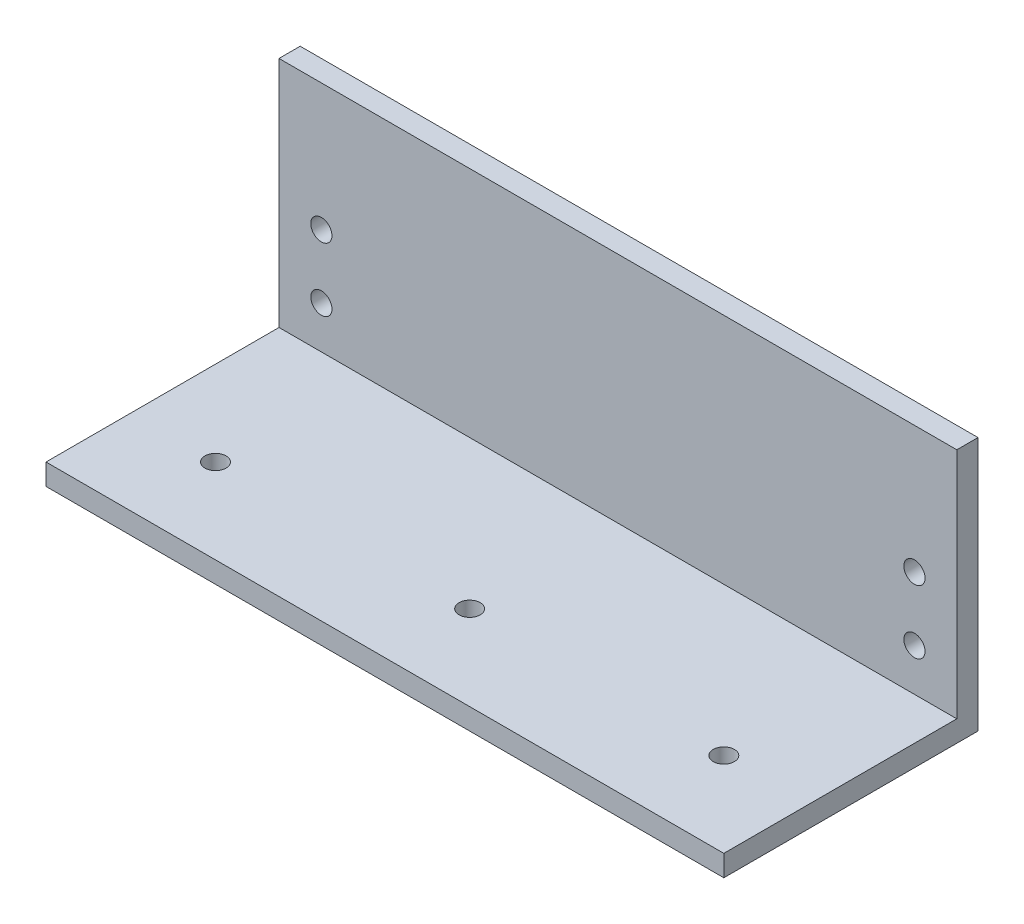
ISO-10303-21;
HEADER;
FILE_DESCRIPTION(('STEP AP214'),'2;1');
FILE_NAME('part.step','',(''),(''),'','','');
FILE_SCHEMA(('AUTOMOTIVE_DESIGN { 1 0 10303 214 1 1 1 1 }'));
ENDSEC;
DATA;
#1=APPLICATION_CONTEXT('core data for automotive mechanical design processes');
#2=APPLICATION_PROTOCOL_DEFINITION('international standard','automotive_design',2000,#1);
#3=PRODUCT_CONTEXT('',#1,'mechanical');
#4=PRODUCT('Part','Part','',(#3));
#5=PRODUCT_RELATED_PRODUCT_CATEGORY('part','',(#4));
#6=PRODUCT_DEFINITION_FORMATION('','',#4);
#7=PRODUCT_DEFINITION_CONTEXT('part definition',#1,'design');
#8=PRODUCT_DEFINITION('design','',#6,#7);
#9=PRODUCT_DEFINITION_SHAPE('','',#8);
#10=(LENGTH_UNIT() NAMED_UNIT(*) SI_UNIT(.MILLI.,.METRE.));
#11=(NAMED_UNIT(*) PLANE_ANGLE_UNIT() SI_UNIT($,.RADIAN.));
#12=(NAMED_UNIT(*) SI_UNIT($,.STERADIAN.) SOLID_ANGLE_UNIT());
#13=UNCERTAINTY_MEASURE_WITH_UNIT(LENGTH_MEASURE(1.E-05),#10,'distance_accuracy_value','');
#14=(GEOMETRIC_REPRESENTATION_CONTEXT(3) GLOBAL_UNCERTAINTY_ASSIGNED_CONTEXT((#13)) GLOBAL_UNIT_ASSIGNED_CONTEXT((#10,
#11,#12)) REPRESENTATION_CONTEXT('',''));
#15=CARTESIAN_POINT('',(0.,0.,0.));
#16=DIRECTION('',(0.,0.,1.));
#17=DIRECTION('',(1.,0.,0.));
#18=AXIS2_PLACEMENT_3D('',#15,#16,#17);
#19=CARTESIAN_POINT('',(203.2,76.2,0.));
#20=DIRECTION('',(0.,1.,0.));
#21=DIRECTION('',(0.,0.,1.));
#22=AXIS2_PLACEMENT_3D('',#19,#20,#21);
#23=PLANE('',#22);
#24=DIRECTION('',(0.,0.,-1.));
#25=VECTOR('',#24,1.);
#26=CARTESIAN_POINT('',(0.,76.2,0.));
#27=LINE('',#26,#25);
#28=CARTESIAN_POINT('',(0.,76.2,-69.85));
#29=VERTEX_POINT('',#28);
#30=CARTESIAN_POINT('',(0.,76.2,-76.2));
#31=VERTEX_POINT('',#30);
#32=EDGE_CURVE('E118',#29,#31,#27,.T.);
#33=ORIENTED_EDGE('',*,*,#32,.F.);
#34=DIRECTION('',(-1.,0.,0.));
#35=VECTOR('',#34,1.);
#36=CARTESIAN_POINT('',(203.2,76.2,-69.85));
#37=LINE('',#36,#35);
#38=CARTESIAN_POINT('',(203.2,76.2,-69.85));
#39=VERTEX_POINT('',#38);
#40=EDGE_CURVE('E11',#39,#29,#37,.T.);
#41=ORIENTED_EDGE('',*,*,#40,.F.);
#42=DIRECTION('',(0.,0.,-1.));
#43=VECTOR('',#42,1.);
#44=CARTESIAN_POINT('',(203.2,76.2,0.));
#45=LINE('',#44,#43);
#46=CARTESIAN_POINT('',(203.2,76.2,-76.2));
#47=VERTEX_POINT('',#46);
#48=EDGE_CURVE('E132',#39,#47,#45,.T.);
#49=ORIENTED_EDGE('',*,*,#48,.T.);
#50=DIRECTION('',(-1.,0.,0.));
#51=VECTOR('',#50,1.);
#52=CARTESIAN_POINT('',(203.2,76.2,-76.2));
#53=LINE('',#52,#51);
#54=EDGE_CURVE('E80',#47,#31,#53,.T.);
#55=ORIENTED_EDGE('',*,*,#54,.T.);
#56=EDGE_LOOP('',(#33,#41,#49,#55));
#57=FACE_BOUND('',#56,.T.);
#58=ADVANCED_FACE('F34',(#57),#23,.T.);
#59=CARTESIAN_POINT('',(203.2,0.,-69.85));
#60=DIRECTION('',(0.,0.,-1.));
#61=DIRECTION('',(0.,1.,0.));
#62=AXIS2_PLACEMENT_3D('',#59,#60,#61);
#63=PLANE('',#62);
#64=CARTESIAN_POINT('',(12.7,38.1,-69.85));
#65=DIRECTION('',(0.,0.,-1.));
#66=DIRECTION('',(0.,1.,0.));
#67=AXIS2_PLACEMENT_3D('',#64,#65,#66);
#68=CIRCLE('',#67,3.175);
#69=CARTESIAN_POINT('',(12.7,41.275,-69.85));
#70=VERTEX_POINT('',#69);
#71=EDGE_CURVE('E158',#70,#70,#68,.T.);
#72=ORIENTED_EDGE('',*,*,#71,.T.);
#73=EDGE_LOOP('',(#72));
#74=FACE_BOUND('',#73,.T.);
#75=CARTESIAN_POINT('',(12.7,19.05,-69.85));
#76=DIRECTION('',(0.,0.,-1.));
#77=DIRECTION('',(0.,1.,0.));
#78=AXIS2_PLACEMENT_3D('',#75,#76,#77);
#79=CIRCLE('',#78,3.175);
#80=CARTESIAN_POINT('',(12.7,22.225,-69.85));
#81=VERTEX_POINT('',#80);
#82=EDGE_CURVE('E164',#81,#81,#79,.T.);
#83=ORIENTED_EDGE('',*,*,#82,.T.);
#84=EDGE_LOOP('',(#83));
#85=FACE_BOUND('',#84,.T.);
#86=CARTESIAN_POINT('',(190.5,38.1,-69.85));
#87=DIRECTION('',(0.,0.,-1.));
#88=DIRECTION('',(0.,1.,0.));
#89=AXIS2_PLACEMENT_3D('',#86,#87,#88);
#90=CIRCLE('',#89,3.175);
#91=CARTESIAN_POINT('',(190.5,41.275,-69.85));
#92=VERTEX_POINT('',#91);
#93=EDGE_CURVE('E170',#92,#92,#90,.T.);
#94=ORIENTED_EDGE('',*,*,#93,.T.);
#95=EDGE_LOOP('',(#94));
#96=FACE_BOUND('',#95,.T.);
#97=CARTESIAN_POINT('',(190.5,19.05,-69.85));
#98=DIRECTION('',(0.,0.,-1.));
#99=DIRECTION('',(0.,1.,0.));
#100=AXIS2_PLACEMENT_3D('',#97,#98,#99);
#101=CIRCLE('',#100,3.175);
#102=CARTESIAN_POINT('',(190.5,22.225,-69.85));
#103=VERTEX_POINT('',#102);
#104=EDGE_CURVE('E122',#103,#103,#101,.T.);
#105=ORIENTED_EDGE('',*,*,#104,.T.);
#106=EDGE_LOOP('',(#105));
#107=FACE_BOUND('',#106,.T.);
#108=DIRECTION('',(0.,-1.,0.));
#109=VECTOR('',#108,1.);
#110=CARTESIAN_POINT('',(0.,0.,-69.85));
#111=LINE('',#110,#109);
#112=CARTESIAN_POINT('',(0.,6.35,-69.85));
#113=VERTEX_POINT('',#112);
#114=EDGE_CURVE('E121',#29,#113,#111,.T.);
#115=ORIENTED_EDGE('',*,*,#114,.T.);
#116=DIRECTION('',(-1.,0.,0.));
#117=VECTOR('',#116,1.);
#118=CARTESIAN_POINT('',(203.2,6.35,-69.85));
#119=LINE('',#118,#117);
#120=CARTESIAN_POINT('',(203.2,6.35,-69.85));
#121=VERTEX_POINT('',#120);
#122=EDGE_CURVE('E43',#121,#113,#119,.T.);
#123=ORIENTED_EDGE('',*,*,#122,.F.);
#124=DIRECTION('',(0.,-1.,0.));
#125=VECTOR('',#124,1.);
#126=CARTESIAN_POINT('',(203.2,0.,-69.85));
#127=LINE('',#126,#125);
#128=EDGE_CURVE('E113',#39,#121,#127,.T.);
#129=ORIENTED_EDGE('',*,*,#128,.F.);
#130=ORIENTED_EDGE('',*,*,#40,.T.);
#131=EDGE_LOOP('',(#115,#123,#129,#130));
#132=FACE_BOUND('',#131,.T.);
#133=ADVANCED_FACE('F180',(#74,#85,#96,#107,#132),#63,.F.);
#134=CARTESIAN_POINT('',(203.2,6.35,0.));
#135=DIRECTION('',(0.,1.,0.));
#136=DIRECTION('',(0.,0.,1.));
#137=AXIS2_PLACEMENT_3D('',#134,#135,#136);
#138=PLANE('',#137);
#139=CARTESIAN_POINT('',(101.6,6.35,-25.4));
#140=DIRECTION('',(0.,1.,0.));
#141=DIRECTION('',(0.,0.,1.));
#142=AXIS2_PLACEMENT_3D('',#139,#140,#141);
#143=CIRCLE('',#142,3.175);
#144=CARTESIAN_POINT('',(101.6,6.35,-22.225));
#145=VERTEX_POINT('',#144);
#146=EDGE_CURVE('E153',#145,#145,#143,.T.);
#147=ORIENTED_EDGE('',*,*,#146,.F.);
#148=EDGE_LOOP('',(#147));
#149=FACE_BOUND('',#148,.T.);
#150=CARTESIAN_POINT('',(177.8,6.35,-25.4));
#151=DIRECTION('',(0.,1.,0.));
#152=DIRECTION('',(0.,0.,1.));
#153=AXIS2_PLACEMENT_3D('',#150,#151,#152);
#154=CIRCLE('',#153,3.175);
#155=CARTESIAN_POINT('',(177.8,6.35,-22.225));
#156=VERTEX_POINT('',#155);
#157=EDGE_CURVE('E143',#156,#156,#154,.T.);
#158=ORIENTED_EDGE('',*,*,#157,.F.);
#159=EDGE_LOOP('',(#158));
#160=FACE_BOUND('',#159,.T.);
#161=CARTESIAN_POINT('',(25.4,6.35,-25.4));
#162=DIRECTION('',(0.,1.,0.));
#163=DIRECTION('',(0.,0.,1.));
#164=AXIS2_PLACEMENT_3D('',#161,#162,#163);
#165=CIRCLE('',#164,3.175);
#166=CARTESIAN_POINT('',(25.4,6.35,-22.225));
#167=VERTEX_POINT('',#166);
#168=EDGE_CURVE('E140',#167,#167,#165,.T.);
#169=ORIENTED_EDGE('',*,*,#168,.F.);
#170=EDGE_LOOP('',(#169));
#171=FACE_BOUND('',#170,.T.);
#172=DIRECTION('',(0.,0.,-1.));
#173=VECTOR('',#172,1.);
#174=CARTESIAN_POINT('',(0.,6.35,0.));
#175=LINE('',#174,#173);
#176=CARTESIAN_POINT('',(0.,6.35,0.));
#177=VERTEX_POINT('',#176);
#178=EDGE_CURVE('E125',#177,#113,#175,.T.);
#179=ORIENTED_EDGE('',*,*,#178,.F.);
#180=DIRECTION('',(-1.,0.,0.));
#181=VECTOR('',#180,1.);
#182=CARTESIAN_POINT('',(203.2,6.35,0.));
#183=LINE('',#182,#181);
#184=CARTESIAN_POINT('',(203.2,6.35,0.));
#185=VERTEX_POINT('',#184);
#186=EDGE_CURVE('E102',#185,#177,#183,.T.);
#187=ORIENTED_EDGE('',*,*,#186,.F.);
#188=DIRECTION('',(0.,0.,-1.));
#189=VECTOR('',#188,1.);
#190=CARTESIAN_POINT('',(203.2,6.35,0.));
#191=LINE('',#190,#189);
#192=EDGE_CURVE('E111',#185,#121,#191,.T.);
#193=ORIENTED_EDGE('',*,*,#192,.T.);
#194=ORIENTED_EDGE('',*,*,#122,.T.);
#195=EDGE_LOOP('',(#179,#187,#193,#194));
#196=FACE_BOUND('',#195,.T.);
#197=ADVANCED_FACE('F184',(#149,#160,#171,#196),#138,.T.);
#198=CARTESIAN_POINT('',(203.2,0.,0.));
#199=DIRECTION('',(0.,0.,1.));
#200=DIRECTION('',(1.,0.,0.));
#201=AXIS2_PLACEMENT_3D('',#198,#199,#200);
#202=PLANE('',#201);
#203=DIRECTION('',(0.,1.,0.));
#204=VECTOR('',#203,1.);
#205=CARTESIAN_POINT('',(0.,0.,0.));
#206=LINE('',#205,#204);
#207=CARTESIAN_POINT('',(0.,0.,0.));
#208=VERTEX_POINT('',#207);
#209=EDGE_CURVE('E101',#208,#177,#206,.T.);
#210=ORIENTED_EDGE('',*,*,#209,.F.);
#211=DIRECTION('',(-1.,0.,0.));
#212=VECTOR('',#211,1.);
#213=CARTESIAN_POINT('',(203.2,0.,0.));
#214=LINE('',#213,#212);
#215=CARTESIAN_POINT('',(203.2,0.,0.));
#216=VERTEX_POINT('',#215);
#217=EDGE_CURVE('E95',#216,#208,#214,.T.);
#218=ORIENTED_EDGE('',*,*,#217,.F.);
#219=DIRECTION('',(0.,1.,0.));
#220=VECTOR('',#219,1.);
#221=CARTESIAN_POINT('',(203.2,0.,0.));
#222=LINE('',#221,#220);
#223=EDGE_CURVE('E99',#216,#185,#222,.T.);
#224=ORIENTED_EDGE('',*,*,#223,.T.);
#225=ORIENTED_EDGE('',*,*,#186,.T.);
#226=EDGE_LOOP('',(#210,#218,#224,#225));
#227=FACE_BOUND('',#226,.T.);
#228=ADVANCED_FACE('F97',(#227),#202,.T.);
#229=CARTESIAN_POINT('',(203.2,0.,0.));
#230=DIRECTION('',(0.,1.,0.));
#231=DIRECTION('',(0.,0.,1.));
#232=AXIS2_PLACEMENT_3D('',#229,#230,#231);
#233=PLANE('',#232);
#234=CARTESIAN_POINT('',(101.6,0.,-25.4));
#235=DIRECTION('',(0.,1.,0.));
#236=DIRECTION('',(0.,0.,1.));
#237=AXIS2_PLACEMENT_3D('',#234,#235,#236);
#238=CIRCLE('',#237,3.175);
#239=CARTESIAN_POINT('',(101.6,0.,-22.225));
#240=VERTEX_POINT('',#239);
#241=EDGE_CURVE('E37',#240,#240,#238,.T.);
#242=ORIENTED_EDGE('',*,*,#241,.T.);
#243=EDGE_LOOP('',(#242));
#244=FACE_BOUND('',#243,.T.);
#245=CARTESIAN_POINT('',(177.8,0.,-25.4));
#246=DIRECTION('',(0.,1.,0.));
#247=DIRECTION('',(0.,0.,1.));
#248=AXIS2_PLACEMENT_3D('',#245,#246,#247);
#249=CIRCLE('',#248,3.175);
#250=CARTESIAN_POINT('',(177.8,0.,-22.225));
#251=VERTEX_POINT('',#250);
#252=EDGE_CURVE('E141',#251,#251,#249,.T.);
#253=ORIENTED_EDGE('',*,*,#252,.T.);
#254=EDGE_LOOP('',(#253));
#255=FACE_BOUND('',#254,.T.);
#256=CARTESIAN_POINT('',(25.4,0.,-25.4));
#257=DIRECTION('',(0.,1.,0.));
#258=DIRECTION('',(0.,0.,1.));
#259=AXIS2_PLACEMENT_3D('',#256,#257,#258);
#260=CIRCLE('',#259,3.175);
#261=CARTESIAN_POINT('',(25.4,0.,-22.225));
#262=VERTEX_POINT('',#261);
#263=EDGE_CURVE('E137',#262,#262,#260,.T.);
#264=ORIENTED_EDGE('',*,*,#263,.T.);
#265=EDGE_LOOP('',(#264));
#266=FACE_BOUND('',#265,.T.);
#267=DIRECTION('',(0.,0.,-1.));
#268=VECTOR('',#267,1.);
#269=CARTESIAN_POINT('',(0.,0.,0.));
#270=LINE('',#269,#268);
#271=CARTESIAN_POINT('',(0.,0.,-76.2));
#272=VERTEX_POINT('',#271);
#273=EDGE_CURVE('E73',#208,#272,#270,.T.);
#274=ORIENTED_EDGE('',*,*,#273,.T.);
#275=DIRECTION('',(-1.,0.,0.));
#276=VECTOR('',#275,1.);
#277=CARTESIAN_POINT('',(203.2,0.,-76.2));
#278=LINE('',#277,#276);
#279=CARTESIAN_POINT('',(203.2,0.,-76.2));
#280=VERTEX_POINT('',#279);
#281=EDGE_CURVE('E103',#280,#272,#278,.T.);
#282=ORIENTED_EDGE('',*,*,#281,.F.);
#283=DIRECTION('',(0.,0.,-1.));
#284=VECTOR('',#283,1.);
#285=CARTESIAN_POINT('',(203.2,0.,0.));
#286=LINE('',#285,#284);
#287=EDGE_CURVE('E105',#216,#280,#286,.T.);
#288=ORIENTED_EDGE('',*,*,#287,.F.);
#289=ORIENTED_EDGE('',*,*,#217,.T.);
#290=EDGE_LOOP('',(#274,#282,#288,#289));
#291=FACE_BOUND('',#290,.T.);
#292=ADVANCED_FACE('F106',(#244,#255,#266,#291),#233,.F.);
#293=CARTESIAN_POINT('',(203.2,0.,-76.2));
#294=DIRECTION('',(0.,0.,1.));
#295=DIRECTION('',(1.,0.,0.));
#296=AXIS2_PLACEMENT_3D('',#293,#294,#295);
#297=PLANE('',#296);
#298=CARTESIAN_POINT('',(12.7,38.1,-76.2));
#299=DIRECTION('',(0.,0.,-1.));
#300=DIRECTION('',(-1.,0.,0.));
#301=AXIS2_PLACEMENT_3D('',#298,#299,#300);
#302=CIRCLE('',#301,3.175);
#303=CARTESIAN_POINT('',(9.52499999999999,38.1,-76.2));
#304=VERTEX_POINT('',#303);
#305=EDGE_CURVE('E139',#304,#304,#302,.T.);
#306=ORIENTED_EDGE('',*,*,#305,.F.);
#307=EDGE_LOOP('',(#306));
#308=FACE_BOUND('',#307,.T.);
#309=CARTESIAN_POINT('',(12.7,19.05,-76.2));
#310=DIRECTION('',(0.,0.,-1.));
#311=DIRECTION('',(-1.,0.,0.));
#312=AXIS2_PLACEMENT_3D('',#309,#310,#311);
#313=CIRCLE('',#312,3.175);
#314=CARTESIAN_POINT('',(9.52499999999999,19.05,-76.2));
#315=VERTEX_POINT('',#314);
#316=EDGE_CURVE('E161',#315,#315,#313,.T.);
#317=ORIENTED_EDGE('',*,*,#316,.F.);
#318=EDGE_LOOP('',(#317));
#319=FACE_BOUND('',#318,.T.);
#320=CARTESIAN_POINT('',(190.5,38.1,-76.2));
#321=DIRECTION('',(0.,0.,-1.));
#322=DIRECTION('',(-1.,0.,0.));
#323=AXIS2_PLACEMENT_3D('',#320,#321,#322);
#324=CIRCLE('',#323,3.175);
#325=CARTESIAN_POINT('',(187.325,38.1,-76.2));
#326=VERTEX_POINT('',#325);
#327=EDGE_CURVE('E167',#326,#326,#324,.T.);
#328=ORIENTED_EDGE('',*,*,#327,.F.);
#329=EDGE_LOOP('',(#328));
#330=FACE_BOUND('',#329,.T.);
#331=CARTESIAN_POINT('',(190.5,19.05,-76.2));
#332=DIRECTION('',(0.,0.,-1.));
#333=DIRECTION('',(-1.,0.,0.));
#334=AXIS2_PLACEMENT_3D('',#331,#332,#333);
#335=CIRCLE('',#334,3.175);
#336=CARTESIAN_POINT('',(187.325,19.05,-76.2));
#337=VERTEX_POINT('',#336);
#338=EDGE_CURVE('E173',#337,#337,#335,.T.);
#339=ORIENTED_EDGE('',*,*,#338,.F.);
#340=EDGE_LOOP('',(#339));
#341=FACE_BOUND('',#340,.T.);
#342=DIRECTION('',(0.,1.,0.));
#343=VECTOR('',#342,1.);
#344=CARTESIAN_POINT('',(0.,0.,-76.2));
#345=LINE('',#344,#343);
#346=EDGE_CURVE('E130',#272,#31,#345,.T.);
#347=ORIENTED_EDGE('',*,*,#346,.T.);
#348=ORIENTED_EDGE('',*,*,#54,.F.);
#349=DIRECTION('',(0.,1.,0.));
#350=VECTOR('',#349,1.);
#351=CARTESIAN_POINT('',(203.2,0.,-76.2));
#352=LINE('',#351,#350);
#353=EDGE_CURVE('E52',#280,#47,#352,.T.);
#354=ORIENTED_EDGE('',*,*,#353,.F.);
#355=ORIENTED_EDGE('',*,*,#281,.T.);
#356=EDGE_LOOP('',(#347,#348,#354,#355));
#357=FACE_BOUND('',#356,.T.);
#358=ADVANCED_FACE('F189',(#308,#319,#330,#341,#357),#297,.F.);
#359=CARTESIAN_POINT('',(203.2,0.,0.));
#360=DIRECTION('',(1.,0.,0.));
#361=DIRECTION('',(0.,0.,-1.));
#362=AXIS2_PLACEMENT_3D('',#359,#360,#361);
#363=PLANE('',#362);
#364=ORIENTED_EDGE('',*,*,#48,.F.);
#365=ORIENTED_EDGE('',*,*,#128,.T.);
#366=ORIENTED_EDGE('',*,*,#192,.F.);
#367=ORIENTED_EDGE('',*,*,#223,.F.);
#368=ORIENTED_EDGE('',*,*,#287,.T.);
#369=ORIENTED_EDGE('',*,*,#353,.T.);
#370=EDGE_LOOP('',(#364,#365,#366,#367,#368,#369));
#371=FACE_BOUND('',#370,.T.);
#372=ADVANCED_FACE('F109',(#371),#363,.T.);
#373=CARTESIAN_POINT('',(0.,0.,0.));
#374=DIRECTION('',(1.,0.,0.));
#375=DIRECTION('',(0.,0.,-1.));
#376=AXIS2_PLACEMENT_3D('',#373,#374,#375);
#377=PLANE('',#376);
#378=ORIENTED_EDGE('',*,*,#32,.T.);
#379=ORIENTED_EDGE('',*,*,#346,.F.);
#380=ORIENTED_EDGE('',*,*,#273,.F.);
#381=ORIENTED_EDGE('',*,*,#209,.T.);
#382=ORIENTED_EDGE('',*,*,#178,.T.);
#383=ORIENTED_EDGE('',*,*,#114,.F.);
#384=EDGE_LOOP('',(#378,#379,#380,#381,#382,#383));
#385=FACE_BOUND('',#384,.T.);
#386=ADVANCED_FACE('F186',(#385),#377,.F.);
#387=CARTESIAN_POINT('',(190.5,19.05,-4.57200000000001));
#388=DIRECTION('',(0.,0.,-1.));
#389=DIRECTION('',(-1.,0.,0.));
#390=AXIS2_PLACEMENT_3D('',#387,#388,#389);
#391=CYLINDRICAL_SURFACE('',#390,3.175);
#392=ORIENTED_EDGE('',*,*,#338,.T.);
#393=EDGE_LOOP('',(#392));
#394=FACE_BOUND('',#393,.T.);
#395=ORIENTED_EDGE('',*,*,#104,.F.);
#396=EDGE_LOOP('',(#395));
#397=FACE_BOUND('',#396,.T.);
#398=ADVANCED_FACE('F212',(#394,#397),#391,.F.);
#399=CARTESIAN_POINT('',(190.5,38.1,-4.57200000000001));
#400=DIRECTION('',(0.,0.,-1.));
#401=DIRECTION('',(-1.,0.,0.));
#402=AXIS2_PLACEMENT_3D('',#399,#400,#401);
#403=CYLINDRICAL_SURFACE('',#402,3.175);
#404=ORIENTED_EDGE('',*,*,#327,.T.);
#405=EDGE_LOOP('',(#404));
#406=FACE_BOUND('',#405,.T.);
#407=ORIENTED_EDGE('',*,*,#93,.F.);
#408=EDGE_LOOP('',(#407));
#409=FACE_BOUND('',#408,.T.);
#410=ADVANCED_FACE('F217',(#406,#409),#403,.F.);
#411=CARTESIAN_POINT('',(12.7,19.05,-4.57200000000001));
#412=DIRECTION('',(0.,0.,-1.));
#413=DIRECTION('',(-1.,0.,0.));
#414=AXIS2_PLACEMENT_3D('',#411,#412,#413);
#415=CYLINDRICAL_SURFACE('',#414,3.175);
#416=ORIENTED_EDGE('',*,*,#316,.T.);
#417=EDGE_LOOP('',(#416));
#418=FACE_BOUND('',#417,.T.);
#419=ORIENTED_EDGE('',*,*,#82,.F.);
#420=EDGE_LOOP('',(#419));
#421=FACE_BOUND('',#420,.T.);
#422=ADVANCED_FACE('F221',(#418,#421),#415,.F.);
#423=CARTESIAN_POINT('',(12.7,38.1,-4.57200000000001));
#424=DIRECTION('',(0.,0.,-1.));
#425=DIRECTION('',(-1.,0.,0.));
#426=AXIS2_PLACEMENT_3D('',#423,#424,#425);
#427=CYLINDRICAL_SURFACE('',#426,3.175);
#428=ORIENTED_EDGE('',*,*,#305,.T.);
#429=EDGE_LOOP('',(#428));
#430=FACE_BOUND('',#429,.T.);
#431=ORIENTED_EDGE('',*,*,#71,.F.);
#432=EDGE_LOOP('',(#431));
#433=FACE_BOUND('',#432,.T.);
#434=ADVANCED_FACE('F225',(#430,#433),#427,.F.);
#435=CARTESIAN_POINT('',(25.4,-238.252,-25.4));
#436=DIRECTION('',(0.,1.,0.));
#437=DIRECTION('',(0.,0.,1.));
#438=AXIS2_PLACEMENT_3D('',#435,#436,#437);
#439=CYLINDRICAL_SURFACE('',#438,3.175);
#440=ORIENTED_EDGE('',*,*,#168,.T.);
#441=EDGE_LOOP('',(#440));
#442=FACE_BOUND('',#441,.T.);
#443=ORIENTED_EDGE('',*,*,#263,.F.);
#444=EDGE_LOOP('',(#443));
#445=FACE_BOUND('',#444,.T.);
#446=ADVANCED_FACE('F229',(#442,#445),#439,.F.);
#447=CARTESIAN_POINT('',(177.8,-238.252,-25.4));
#448=DIRECTION('',(0.,1.,0.));
#449=DIRECTION('',(0.,0.,1.));
#450=AXIS2_PLACEMENT_3D('',#447,#448,#449);
#451=CYLINDRICAL_SURFACE('',#450,3.175);
#452=ORIENTED_EDGE('',*,*,#157,.T.);
#453=EDGE_LOOP('',(#452));
#454=FACE_BOUND('',#453,.T.);
#455=ORIENTED_EDGE('',*,*,#252,.F.);
#456=EDGE_LOOP('',(#455));
#457=FACE_BOUND('',#456,.T.);
#458=ADVANCED_FACE('F233',(#454,#457),#451,.F.);
#459=CARTESIAN_POINT('',(101.6,-238.252,-25.4));
#460=DIRECTION('',(0.,1.,0.));
#461=DIRECTION('',(0.,0.,1.));
#462=AXIS2_PLACEMENT_3D('',#459,#460,#461);
#463=CYLINDRICAL_SURFACE('',#462,3.175);
#464=ORIENTED_EDGE('',*,*,#146,.T.);
#465=EDGE_LOOP('',(#464));
#466=FACE_BOUND('',#465,.T.);
#467=ORIENTED_EDGE('',*,*,#241,.F.);
#468=EDGE_LOOP('',(#467));
#469=FACE_BOUND('',#468,.T.);
#470=ADVANCED_FACE('F237',(#466,#469),#463,.F.);
#471=CLOSED_SHELL('',(#58,#133,#197,#228,#292,#358,#372,#386,#398,#410,#422,#434,#446,#458,#470));
#472=MANIFOLD_SOLID_BREP('B2',#471);
#473=ADVANCED_BREP_SHAPE_REPRESENTATION('',(#18,#472),#14);
#474=SHAPE_DEFINITION_REPRESENTATION(#9,#473);
ENDSEC;
END-ISO-10303-21;
